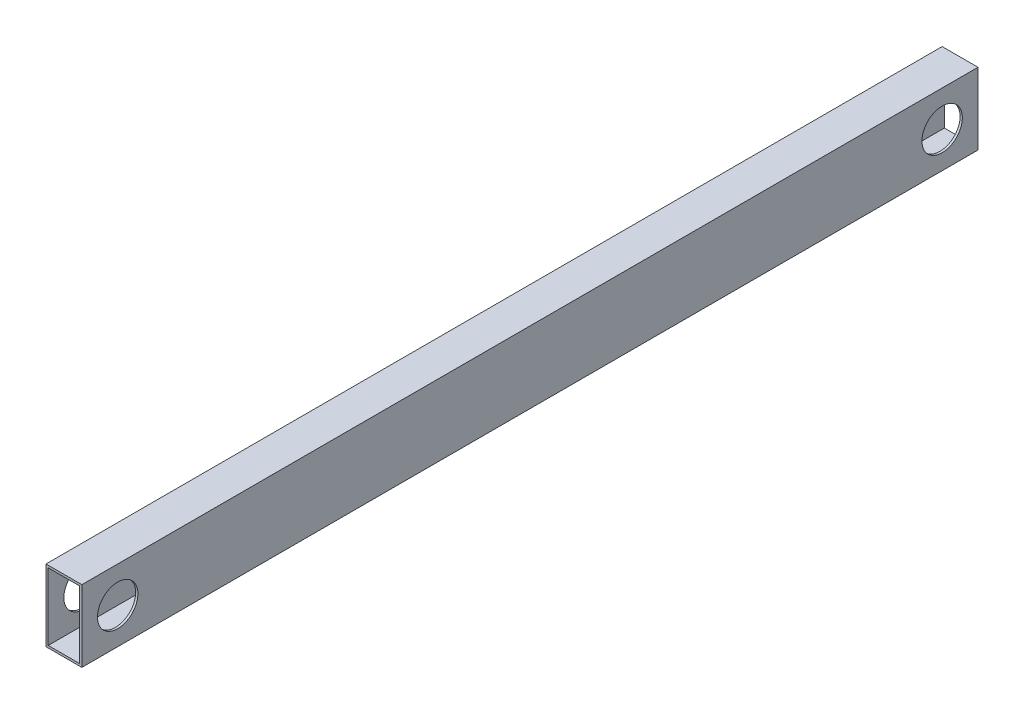
ISO-10303-21;
HEADER;
FILE_DESCRIPTION(('STEP AP214'),'2;1');
FILE_NAME('part.step','',(''),(''),'','','');
FILE_SCHEMA(('AUTOMOTIVE_DESIGN { 1 0 10303 214 1 1 1 1 }'));
ENDSEC;
DATA;
#1=APPLICATION_CONTEXT('core data for automotive mechanical design processes');
#2=APPLICATION_PROTOCOL_DEFINITION('international standard','automotive_design',2000,#1);
#3=PRODUCT_CONTEXT('',#1,'mechanical');
#4=PRODUCT('Part','Part','',(#3));
#5=PRODUCT_RELATED_PRODUCT_CATEGORY('part','',(#4));
#6=PRODUCT_DEFINITION_FORMATION('','',#4);
#7=PRODUCT_DEFINITION_CONTEXT('part definition',#1,'design');
#8=PRODUCT_DEFINITION('design','',#6,#7);
#9=PRODUCT_DEFINITION_SHAPE('','',#8);
#10=(LENGTH_UNIT() NAMED_UNIT(*) SI_UNIT(.MILLI.,.METRE.));
#11=(NAMED_UNIT(*) PLANE_ANGLE_UNIT() SI_UNIT($,.RADIAN.));
#12=(NAMED_UNIT(*) SI_UNIT($,.STERADIAN.) SOLID_ANGLE_UNIT());
#13=UNCERTAINTY_MEASURE_WITH_UNIT(LENGTH_MEASURE(1.E-05),#10,'distance_accuracy_value','');
#14=(GEOMETRIC_REPRESENTATION_CONTEXT(3) GLOBAL_UNCERTAINTY_ASSIGNED_CONTEXT((#13)) GLOBAL_UNIT_ASSIGNED_CONTEXT((#10,
#11,#12)) REPRESENTATION_CONTEXT('',''));
#15=CARTESIAN_POINT('',(0.,0.,0.));
#16=DIRECTION('',(0.,0.,1.));
#17=DIRECTION('',(1.,0.,0.));
#18=AXIS2_PLACEMENT_3D('',#15,#16,#17);
#19=CARTESIAN_POINT('',(0.,0.,635.));
#20=DIRECTION('',(0.,0.,-1.));
#21=DIRECTION('',(-1.,0.,0.));
#22=AXIS2_PLACEMENT_3D('',#19,#20,#21);
#23=PLANE('',#22);
#24=DIRECTION('',(0.,-1.,0.));
#25=VECTOR('',#24,1.);
#26=CARTESIAN_POINT('',(0.,0.,635.));
#27=LINE('',#26,#25);
#28=CARTESIAN_POINT('',(0.,50.8,635.));
#29=VERTEX_POINT('',#28);
#30=CARTESIAN_POINT('',(0.,0.,635.));
#31=VERTEX_POINT('',#30);
#32=EDGE_CURVE('E138',#29,#31,#27,.T.);
#33=ORIENTED_EDGE('',*,*,#32,.T.);
#34=DIRECTION('',(1.,0.,0.));
#35=VECTOR('',#34,1.);
#36=CARTESIAN_POINT('',(0.,0.,635.));
#37=LINE('',#36,#35);
#38=CARTESIAN_POINT('',(25.4,0.,635.));
#39=VERTEX_POINT('',#38);
#40=EDGE_CURVE('E141',#31,#39,#37,.T.);
#41=ORIENTED_EDGE('',*,*,#40,.T.);
#42=DIRECTION('',(0.,1.,0.));
#43=VECTOR('',#42,1.);
#44=CARTESIAN_POINT('',(25.4,0.,635.));
#45=LINE('',#44,#43);
#46=CARTESIAN_POINT('',(25.4,50.8,635.));
#47=VERTEX_POINT('',#46);
#48=EDGE_CURVE('E144',#39,#47,#45,.T.);
#49=ORIENTED_EDGE('',*,*,#48,.T.);
#50=DIRECTION('',(-1.,0.,0.));
#51=VECTOR('',#50,1.);
#52=CARTESIAN_POINT('',(0.,50.8,635.));
#53=LINE('',#52,#51);
#54=EDGE_CURVE('E146',#47,#29,#53,.T.);
#55=ORIENTED_EDGE('',*,*,#54,.T.);
#56=EDGE_LOOP('',(#33,#41,#49,#55));
#57=FACE_BOUND('',#56,.T.);
#58=DIRECTION('',(0.,1.,0.));
#59=VECTOR('',#58,1.);
#60=CARTESIAN_POINT('',(23.8125,49.2125,635.));
#61=LINE('',#60,#59);
#62=CARTESIAN_POINT('',(23.8125,1.58749999999999,635.));
#63=VERTEX_POINT('',#62);
#64=CARTESIAN_POINT('',(23.8125,49.2125,635.));
#65=VERTEX_POINT('',#64);
#66=EDGE_CURVE('E100',#63,#65,#61,.T.);
#67=ORIENTED_EDGE('',*,*,#66,.F.);
#68=DIRECTION('',(1.,0.,0.));
#69=VECTOR('',#68,1.);
#70=CARTESIAN_POINT('',(1.5875,1.58749999999999,635.));
#71=LINE('',#70,#69);
#72=CARTESIAN_POINT('',(1.5875,1.58749999999999,635.));
#73=VERTEX_POINT('',#72);
#74=EDGE_CURVE('E122',#73,#63,#71,.T.);
#75=ORIENTED_EDGE('',*,*,#74,.F.);
#76=DIRECTION('',(0.,-1.,0.));
#77=VECTOR('',#76,1.);
#78=CARTESIAN_POINT('',(1.5875,49.2125,635.));
#79=LINE('',#78,#77);
#80=CARTESIAN_POINT('',(1.5875,49.2125,635.));
#81=VERTEX_POINT('',#80);
#82=EDGE_CURVE('E120',#81,#73,#79,.T.);
#83=ORIENTED_EDGE('',*,*,#82,.F.);
#84=DIRECTION('',(-1.,0.,0.));
#85=VECTOR('',#84,1.);
#86=CARTESIAN_POINT('',(1.5875,49.2125,635.));
#87=LINE('',#86,#85);
#88=EDGE_CURVE('E108',#65,#81,#87,.T.);
#89=ORIENTED_EDGE('',*,*,#88,.F.);
#90=EDGE_LOOP('',(#67,#75,#83,#89));
#91=FACE_BOUND('',#90,.T.);
#92=ADVANCED_FACE('F33',(#57,#91),#23,.F.);
#93=CARTESIAN_POINT('',(0.,0.,0.));
#94=DIRECTION('',(0.,0.,-1.));
#95=DIRECTION('',(-1.,0.,0.));
#96=AXIS2_PLACEMENT_3D('',#93,#94,#95);
#97=PLANE('',#96);
#98=DIRECTION('',(0.,-1.,0.));
#99=VECTOR('',#98,1.);
#100=CARTESIAN_POINT('',(0.,0.,0.));
#101=LINE('',#100,#99);
#102=CARTESIAN_POINT('',(0.,50.8,0.));
#103=VERTEX_POINT('',#102);
#104=CARTESIAN_POINT('',(0.,0.,0.));
#105=VERTEX_POINT('',#104);
#106=EDGE_CURVE('E116',#103,#105,#101,.T.);
#107=ORIENTED_EDGE('',*,*,#106,.F.);
#108=DIRECTION('',(-1.,0.,0.));
#109=VECTOR('',#108,1.);
#110=CARTESIAN_POINT('',(0.,50.8,0.));
#111=LINE('',#110,#109);
#112=CARTESIAN_POINT('',(25.4,50.8,0.));
#113=VERTEX_POINT('',#112);
#114=EDGE_CURVE('E142',#113,#103,#111,.T.);
#115=ORIENTED_EDGE('',*,*,#114,.F.);
#116=DIRECTION('',(0.,1.,0.));
#117=VECTOR('',#116,1.);
#118=CARTESIAN_POINT('',(25.4,0.,0.));
#119=LINE('',#118,#117);
#120=CARTESIAN_POINT('',(25.4,0.,0.));
#121=VERTEX_POINT('',#120);
#122=EDGE_CURVE('E153',#121,#113,#119,.T.);
#123=ORIENTED_EDGE('',*,*,#122,.F.);
#124=DIRECTION('',(1.,0.,0.));
#125=VECTOR('',#124,1.);
#126=CARTESIAN_POINT('',(0.,0.,0.));
#127=LINE('',#126,#125);
#128=EDGE_CURVE('E151',#105,#121,#127,.T.);
#129=ORIENTED_EDGE('',*,*,#128,.F.);
#130=EDGE_LOOP('',(#107,#115,#123,#129));
#131=FACE_BOUND('',#130,.T.);
#132=DIRECTION('',(1.,0.,0.));
#133=VECTOR('',#132,1.);
#134=CARTESIAN_POINT('',(1.5875,1.58749999999999,0.));
#135=LINE('',#134,#133);
#136=CARTESIAN_POINT('',(1.5875,1.58749999999999,0.));
#137=VERTEX_POINT('',#136);
#138=CARTESIAN_POINT('',(23.8125,1.58749999999999,0.));
#139=VERTEX_POINT('',#138);
#140=EDGE_CURVE('E109',#137,#139,#135,.T.);
#141=ORIENTED_EDGE('',*,*,#140,.T.);
#142=DIRECTION('',(0.,1.,0.));
#143=VECTOR('',#142,1.);
#144=CARTESIAN_POINT('',(23.8125,49.2125,0.));
#145=LINE('',#144,#143);
#146=CARTESIAN_POINT('',(23.8125,49.2125,0.));
#147=VERTEX_POINT('',#146);
#148=EDGE_CURVE('E58',#139,#147,#145,.T.);
#149=ORIENTED_EDGE('',*,*,#148,.T.);
#150=DIRECTION('',(-1.,0.,0.));
#151=VECTOR('',#150,1.);
#152=CARTESIAN_POINT('',(1.5875,49.2125,0.));
#153=LINE('',#152,#151);
#154=CARTESIAN_POINT('',(1.5875,49.2125,0.));
#155=VERTEX_POINT('',#154);
#156=EDGE_CURVE('E115',#147,#155,#153,.T.);
#157=ORIENTED_EDGE('',*,*,#156,.T.);
#158=DIRECTION('',(0.,-1.,0.));
#159=VECTOR('',#158,1.);
#160=CARTESIAN_POINT('',(1.5875,49.2125,0.));
#161=LINE('',#160,#159);
#162=EDGE_CURVE('E130',#155,#137,#161,.T.);
#163=ORIENTED_EDGE('',*,*,#162,.T.);
#164=EDGE_LOOP('',(#141,#149,#157,#163));
#165=FACE_BOUND('',#164,.T.);
#166=ADVANCED_FACE('F204',(#131,#165),#97,.T.);
#167=CARTESIAN_POINT('',(0.,0.,635.));
#168=DIRECTION('',(1.,0.,0.));
#169=DIRECTION('',(0.,0.,-1.));
#170=AXIS2_PLACEMENT_3D('',#167,#168,#169);
#171=PLANE('',#170);
#172=CARTESIAN_POINT('',(0.,25.4,25.4));
#173=DIRECTION('',(1.,0.,0.));
#174=DIRECTION('',(0.,0.,-1.));
#175=AXIS2_PLACEMENT_3D('',#172,#173,#174);
#176=CIRCLE('',#175,14.3129);
#177=CARTESIAN_POINT('',(0.,25.4,11.0871));
#178=VERTEX_POINT('',#177);
#179=EDGE_CURVE('E165',#178,#178,#176,.T.);
#180=ORIENTED_EDGE('',*,*,#179,.T.);
#181=EDGE_LOOP('',(#180));
#182=FACE_BOUND('',#181,.T.);
#183=CARTESIAN_POINT('',(0.,25.4,609.6));
#184=DIRECTION('',(1.,0.,0.));
#185=DIRECTION('',(0.,0.,1.));
#186=AXIS2_PLACEMENT_3D('',#183,#184,#185);
#187=CIRCLE('',#186,14.3129);
#188=CARTESIAN_POINT('',(0.,25.4,623.9129));
#189=VERTEX_POINT('',#188);
#190=EDGE_CURVE('E172',#189,#189,#187,.T.);
#191=ORIENTED_EDGE('',*,*,#190,.T.);
#192=EDGE_LOOP('',(#191));
#193=FACE_BOUND('',#192,.T.);
#194=ORIENTED_EDGE('',*,*,#106,.T.);
#195=DIRECTION('',(0.,0.,-1.));
#196=VECTOR('',#195,1.);
#197=CARTESIAN_POINT('',(0.,0.,635.));
#198=LINE('',#197,#196);
#199=EDGE_CURVE('E11',#31,#105,#198,.T.);
#200=ORIENTED_EDGE('',*,*,#199,.F.);
#201=ORIENTED_EDGE('',*,*,#32,.F.);
#202=DIRECTION('',(0.,0.,-1.));
#203=VECTOR('',#202,1.);
#204=CARTESIAN_POINT('',(0.,50.8,635.));
#205=LINE('',#204,#203);
#206=EDGE_CURVE('E148',#29,#103,#205,.T.);
#207=ORIENTED_EDGE('',*,*,#206,.T.);
#208=EDGE_LOOP('',(#194,#200,#201,#207));
#209=FACE_BOUND('',#208,.T.);
#210=ADVANCED_FACE('F35',(#182,#193,#209),#171,.F.);
#211=CARTESIAN_POINT('',(0.,0.,635.));
#212=DIRECTION('',(0.,1.,0.));
#213=DIRECTION('',(0.,0.,1.));
#214=AXIS2_PLACEMENT_3D('',#211,#212,#213);
#215=PLANE('',#214);
#216=ORIENTED_EDGE('',*,*,#128,.T.);
#217=DIRECTION('',(0.,0.,-1.));
#218=VECTOR('',#217,1.);
#219=CARTESIAN_POINT('',(25.4,0.,635.));
#220=LINE('',#219,#218);
#221=EDGE_CURVE('E42',#39,#121,#220,.T.);
#222=ORIENTED_EDGE('',*,*,#221,.F.);
#223=ORIENTED_EDGE('',*,*,#40,.F.);
#224=ORIENTED_EDGE('',*,*,#199,.T.);
#225=EDGE_LOOP('',(#216,#222,#223,#224));
#226=FACE_BOUND('',#225,.T.);
#227=ADVANCED_FACE('F220',(#226),#215,.F.);
#228=CARTESIAN_POINT('',(25.4,0.,635.));
#229=DIRECTION('',(-1.,0.,0.));
#230=DIRECTION('',(0.,0.,1.));
#231=AXIS2_PLACEMENT_3D('',#228,#229,#230);
#232=PLANE('',#231);
#233=CARTESIAN_POINT('',(25.4,25.4,25.4));
#234=DIRECTION('',(-1.,0.,0.));
#235=DIRECTION('',(0.,0.,1.));
#236=AXIS2_PLACEMENT_3D('',#233,#234,#235);
#237=CIRCLE('',#236,14.3129);
#238=CARTESIAN_POINT('',(25.4,25.4,11.0871));
#239=VERTEX_POINT('',#238);
#240=EDGE_CURVE('E128',#239,#239,#237,.T.);
#241=ORIENTED_EDGE('',*,*,#240,.T.);
#242=EDGE_LOOP('',(#241));
#243=FACE_BOUND('',#242,.T.);
#244=CARTESIAN_POINT('',(25.4,25.4,609.6));
#245=DIRECTION('',(-1.,0.,0.));
#246=DIRECTION('',(0.,0.,1.));
#247=AXIS2_PLACEMENT_3D('',#244,#245,#246);
#248=CIRCLE('',#247,14.3129);
#249=CARTESIAN_POINT('',(25.4,25.4,595.2871));
#250=VERTEX_POINT('',#249);
#251=EDGE_CURVE('E169',#250,#250,#248,.T.);
#252=ORIENTED_EDGE('',*,*,#251,.T.);
#253=EDGE_LOOP('',(#252));
#254=FACE_BOUND('',#253,.T.);
#255=ORIENTED_EDGE('',*,*,#122,.T.);
#256=DIRECTION('',(0.,0.,-1.));
#257=VECTOR('',#256,1.);
#258=CARTESIAN_POINT('',(25.4,50.8,635.));
#259=LINE('',#258,#257);
#260=EDGE_CURVE('E158',#47,#113,#259,.T.);
#261=ORIENTED_EDGE('',*,*,#260,.F.);
#262=ORIENTED_EDGE('',*,*,#48,.F.);
#263=ORIENTED_EDGE('',*,*,#221,.T.);
#264=EDGE_LOOP('',(#255,#261,#262,#263));
#265=FACE_BOUND('',#264,.T.);
#266=ADVANCED_FACE('F186',(#243,#254,#265),#232,.F.);
#267=CARTESIAN_POINT('',(0.,50.8,635.));
#268=DIRECTION('',(0.,-1.,0.));
#269=DIRECTION('',(0.,0.,-1.));
#270=AXIS2_PLACEMENT_3D('',#267,#268,#269);
#271=PLANE('',#270);
#272=ORIENTED_EDGE('',*,*,#114,.T.);
#273=ORIENTED_EDGE('',*,*,#206,.F.);
#274=ORIENTED_EDGE('',*,*,#54,.F.);
#275=ORIENTED_EDGE('',*,*,#260,.T.);
#276=EDGE_LOOP('',(#272,#273,#274,#275));
#277=FACE_BOUND('',#276,.T.);
#278=ADVANCED_FACE('F215',(#277),#271,.F.);
#279=CARTESIAN_POINT('',(23.8125,49.2125,635.));
#280=DIRECTION('',(-1.,0.,0.));
#281=DIRECTION('',(0.,0.,1.));
#282=AXIS2_PLACEMENT_3D('',#279,#280,#281);
#283=PLANE('',#282);
#284=CARTESIAN_POINT('',(23.8125,25.4,25.4));
#285=DIRECTION('',(-1.,0.,0.));
#286=DIRECTION('',(0.,0.,1.));
#287=AXIS2_PLACEMENT_3D('',#284,#285,#286);
#288=CIRCLE('',#287,14.3129);
#289=CARTESIAN_POINT('',(23.8125,25.4,11.0871));
#290=VERTEX_POINT('',#289);
#291=EDGE_CURVE('E181',#290,#290,#288,.T.);
#292=ORIENTED_EDGE('',*,*,#291,.F.);
#293=EDGE_LOOP('',(#292));
#294=FACE_BOUND('',#293,.T.);
#295=CARTESIAN_POINT('',(23.8125,25.4,609.6));
#296=DIRECTION('',(-1.,0.,0.));
#297=DIRECTION('',(0.,0.,1.));
#298=AXIS2_PLACEMENT_3D('',#295,#296,#297);
#299=CIRCLE('',#298,14.3129);
#300=CARTESIAN_POINT('',(23.8125,25.4,595.2871));
#301=VERTEX_POINT('',#300);
#302=EDGE_CURVE('E164',#301,#301,#299,.T.);
#303=ORIENTED_EDGE('',*,*,#302,.F.);
#304=EDGE_LOOP('',(#303));
#305=FACE_BOUND('',#304,.T.);
#306=ORIENTED_EDGE('',*,*,#148,.F.);
#307=DIRECTION('',(0.,0.,-1.));
#308=VECTOR('',#307,1.);
#309=CARTESIAN_POINT('',(23.8125,1.58749999999999,635.));
#310=LINE('',#309,#308);
#311=EDGE_CURVE('E104',#63,#139,#310,.T.);
#312=ORIENTED_EDGE('',*,*,#311,.F.);
#313=ORIENTED_EDGE('',*,*,#66,.T.);
#314=DIRECTION('',(0.,0.,-1.));
#315=VECTOR('',#314,1.);
#316=CARTESIAN_POINT('',(23.8125,49.2125,635.));
#317=LINE('',#316,#315);
#318=EDGE_CURVE('E103',#65,#147,#317,.T.);
#319=ORIENTED_EDGE('',*,*,#318,.T.);
#320=EDGE_LOOP('',(#306,#312,#313,#319));
#321=FACE_BOUND('',#320,.T.);
#322=ADVANCED_FACE('F102',(#294,#305,#321),#283,.T.);
#323=CARTESIAN_POINT('',(1.5875,49.2125,635.));
#324=DIRECTION('',(0.,-1.,0.));
#325=DIRECTION('',(0.,0.,-1.));
#326=AXIS2_PLACEMENT_3D('',#323,#324,#325);
#327=PLANE('',#326);
#328=ORIENTED_EDGE('',*,*,#156,.F.);
#329=ORIENTED_EDGE('',*,*,#318,.F.);
#330=ORIENTED_EDGE('',*,*,#88,.T.);
#331=DIRECTION('',(0.,0.,-1.));
#332=VECTOR('',#331,1.);
#333=CARTESIAN_POINT('',(1.5875,49.2125,635.));
#334=LINE('',#333,#332);
#335=EDGE_CURVE('E117',#81,#155,#334,.T.);
#336=ORIENTED_EDGE('',*,*,#335,.T.);
#337=EDGE_LOOP('',(#328,#329,#330,#336));
#338=FACE_BOUND('',#337,.T.);
#339=ADVANCED_FACE('F112',(#338),#327,.T.);
#340=CARTESIAN_POINT('',(1.5875,49.2125,635.));
#341=DIRECTION('',(1.,0.,0.));
#342=DIRECTION('',(0.,0.,-1.));
#343=AXIS2_PLACEMENT_3D('',#340,#341,#342);
#344=PLANE('',#343);
#345=CARTESIAN_POINT('',(1.5875,25.4,25.4));
#346=DIRECTION('',(1.,0.,0.));
#347=DIRECTION('',(0.,0.,-1.));
#348=AXIS2_PLACEMENT_3D('',#345,#346,#347);
#349=CIRCLE('',#348,14.3129);
#350=CARTESIAN_POINT('',(1.5875,25.4,11.0871));
#351=VERTEX_POINT('',#350);
#352=EDGE_CURVE('E37',#351,#351,#349,.T.);
#353=ORIENTED_EDGE('',*,*,#352,.F.);
#354=EDGE_LOOP('',(#353));
#355=FACE_BOUND('',#354,.T.);
#356=CARTESIAN_POINT('',(1.5875,25.4,609.6));
#357=DIRECTION('',(1.,0.,0.));
#358=DIRECTION('',(0.,0.,-1.));
#359=AXIS2_PLACEMENT_3D('',#356,#357,#358);
#360=CIRCLE('',#359,14.3129);
#361=CARTESIAN_POINT('',(1.5875,25.4,595.2871));
#362=VERTEX_POINT('',#361);
#363=EDGE_CURVE('E162',#362,#362,#360,.T.);
#364=ORIENTED_EDGE('',*,*,#363,.F.);
#365=EDGE_LOOP('',(#364));
#366=FACE_BOUND('',#365,.T.);
#367=ORIENTED_EDGE('',*,*,#162,.F.);
#368=ORIENTED_EDGE('',*,*,#335,.F.);
#369=ORIENTED_EDGE('',*,*,#82,.T.);
#370=DIRECTION('',(0.,0.,-1.));
#371=VECTOR('',#370,1.);
#372=CARTESIAN_POINT('',(1.5875,1.58749999999999,635.));
#373=LINE('',#372,#371);
#374=EDGE_CURVE('E50',#73,#137,#373,.T.);
#375=ORIENTED_EDGE('',*,*,#374,.T.);
#376=EDGE_LOOP('',(#367,#368,#369,#375));
#377=FACE_BOUND('',#376,.T.);
#378=ADVANCED_FACE('F242',(#355,#366,#377),#344,.T.);
#379=CARTESIAN_POINT('',(1.5875,1.58749999999999,635.));
#380=DIRECTION('',(0.,1.,0.));
#381=DIRECTION('',(0.,0.,1.));
#382=AXIS2_PLACEMENT_3D('',#379,#380,#381);
#383=PLANE('',#382);
#384=ORIENTED_EDGE('',*,*,#140,.F.);
#385=ORIENTED_EDGE('',*,*,#374,.F.);
#386=ORIENTED_EDGE('',*,*,#74,.T.);
#387=ORIENTED_EDGE('',*,*,#311,.T.);
#388=EDGE_LOOP('',(#384,#385,#386,#387));
#389=FACE_BOUND('',#388,.T.);
#390=ADVANCED_FACE('F240',(#389),#383,.T.);
#391=CARTESIAN_POINT('',(0.,25.4,609.6));
#392=DIRECTION('',(1.,0.,0.));
#393=DIRECTION('',(0.,0.,-1.));
#394=AXIS2_PLACEMENT_3D('',#391,#392,#393);
#395=CYLINDRICAL_SURFACE('',#394,14.3129);
#396=ORIENTED_EDGE('',*,*,#363,.T.);
#397=EDGE_LOOP('',(#396));
#398=FACE_BOUND('',#397,.T.);
#399=ORIENTED_EDGE('',*,*,#190,.F.);
#400=EDGE_LOOP('',(#399));
#401=FACE_BOUND('',#400,.T.);
#402=ADVANCED_FACE('F200',(#398,#401),#395,.F.);
#403=CARTESIAN_POINT('',(0.,25.4,25.4));
#404=DIRECTION('',(1.,0.,0.));
#405=DIRECTION('',(0.,0.,-1.));
#406=AXIS2_PLACEMENT_3D('',#403,#404,#405);
#407=CYLINDRICAL_SURFACE('',#406,14.3129);
#408=ORIENTED_EDGE('',*,*,#352,.T.);
#409=EDGE_LOOP('',(#408));
#410=FACE_BOUND('',#409,.T.);
#411=ORIENTED_EDGE('',*,*,#179,.F.);
#412=EDGE_LOOP('',(#411));
#413=FACE_BOUND('',#412,.T.);
#414=ADVANCED_FACE('F194',(#410,#413),#407,.F.);
#415=CARTESIAN_POINT('',(23.8125,25.4,595.2871));
#416=CARTESIAN_POINT('',(23.8290364583333,25.4,595.2871));
#417=CARTESIAN_POINT('',(23.8455729166667,25.4,595.2871));
#418=CARTESIAN_POINT('',(23.8786458333333,25.4,595.2871));
#419=CARTESIAN_POINT('',(23.8951822916667,25.4,595.2871));
#420=CARTESIAN_POINT('',(23.9282552083333,25.4,595.2871));
#421=CARTESIAN_POINT('',(23.9447916666667,25.4,595.2871));
#422=CARTESIAN_POINT('',(23.9778645833333,25.4,595.2871));
#423=CARTESIAN_POINT('',(23.9944010416667,25.4,595.2871));
#424=CARTESIAN_POINT('',(24.0274739583333,25.4,595.2871));
#425=CARTESIAN_POINT('',(24.0440104166667,25.4,595.2871));
#426=CARTESIAN_POINT('',(24.0770833333333,25.4,595.2871));
#427=CARTESIAN_POINT('',(24.0936197916667,25.4,595.2871));
#428=CARTESIAN_POINT('',(24.1266927083333,25.4,595.2871));
#429=CARTESIAN_POINT('',(24.1432291666667,25.4,595.2871));
#430=CARTESIAN_POINT('',(24.1763020833333,25.4,595.2871));
#431=CARTESIAN_POINT('',(24.1928385416667,25.4,595.2871));
#432=CARTESIAN_POINT('',(24.2259114583333,25.4,595.2871));
#433=CARTESIAN_POINT('',(24.2424479166667,25.4,595.2871));
#434=CARTESIAN_POINT('',(24.2755208333333,25.4,595.2871));
#435=CARTESIAN_POINT('',(24.2920572916667,25.4,595.2871));
#436=CARTESIAN_POINT('',(24.3251302083333,25.4,595.2871));
#437=CARTESIAN_POINT('',(24.3416666666667,25.4,595.2871));
#438=CARTESIAN_POINT('',(24.3747395833333,25.4,595.2871));
#439=CARTESIAN_POINT('',(24.3912760416667,25.4,595.2871));
#440=CARTESIAN_POINT('',(24.4243489583333,25.4,595.2871));
#441=CARTESIAN_POINT('',(24.4408854166667,25.4,595.2871));
#442=CARTESIAN_POINT('',(24.4739583333333,25.4,595.2871));
#443=CARTESIAN_POINT('',(24.4904947916667,25.4,595.2871));
#444=CARTESIAN_POINT('',(24.5235677083333,25.4,595.2871));
#445=CARTESIAN_POINT('',(24.5401041666667,25.4,595.2871));
#446=CARTESIAN_POINT('',(24.5731770833333,25.4,595.2871));
#447=CARTESIAN_POINT('',(24.5897135416667,25.4,595.2871));
#448=CARTESIAN_POINT('',(24.6227864583333,25.4,595.2871));
#449=CARTESIAN_POINT('',(24.6393229166667,25.4,595.2871));
#450=CARTESIAN_POINT('',(24.6723958333333,25.4,595.2871));
#451=CARTESIAN_POINT('',(24.6889322916667,25.4,595.2871));
#452=CARTESIAN_POINT('',(24.7220052083333,25.4,595.2871));
#453=CARTESIAN_POINT('',(24.7385416666667,25.4,595.2871));
#454=CARTESIAN_POINT('',(24.7716145833333,25.4,595.2871));
#455=CARTESIAN_POINT('',(24.7881510416667,25.4,595.2871));
#456=CARTESIAN_POINT('',(24.8212239583333,25.4,595.2871));
#457=CARTESIAN_POINT('',(24.8377604166667,25.4,595.2871));
#458=CARTESIAN_POINT('',(24.8708333333333,25.4,595.2871));
#459=CARTESIAN_POINT('',(24.8873697916667,25.4,595.2871));
#460=CARTESIAN_POINT('',(24.9204427083333,25.4,595.2871));
#461=CARTESIAN_POINT('',(24.9369791666667,25.4,595.2871));
#462=CARTESIAN_POINT('',(24.9700520833333,25.4,595.2871));
#463=CARTESIAN_POINT('',(24.9865885416667,25.4,595.2871));
#464=CARTESIAN_POINT('',(25.0196614583333,25.4,595.2871));
#465=CARTESIAN_POINT('',(25.0361979166667,25.4,595.2871));
#466=CARTESIAN_POINT('',(25.0692708333333,25.4,595.2871));
#467=CARTESIAN_POINT('',(25.0858072916667,25.4,595.2871));
#468=CARTESIAN_POINT('',(25.1188802083333,25.4,595.2871));
#469=CARTESIAN_POINT('',(25.1354166666667,25.4,595.2871));
#470=CARTESIAN_POINT('',(25.1684895833333,25.4,595.2871));
#471=CARTESIAN_POINT('',(25.1850260416667,25.4,595.2871));
#472=CARTESIAN_POINT('',(25.2180989583333,25.4,595.2871));
#473=CARTESIAN_POINT('',(25.2346354166667,25.4,595.2871));
#474=CARTESIAN_POINT('',(25.2677083333333,25.4,595.2871));
#475=CARTESIAN_POINT('',(25.2842447916667,25.4,595.2871));
#476=CARTESIAN_POINT('',(25.3173177083333,25.4,595.2871));
#477=CARTESIAN_POINT('',(25.3338541666667,25.4,595.2871));
#478=CARTESIAN_POINT('',(25.3669270833333,25.4,595.2871));
#479=CARTESIAN_POINT('',(25.3834635416667,25.4,595.2871));
#480=CARTESIAN_POINT('',(25.4,25.4,595.2871));
#481=B_SPLINE_CURVE_WITH_KNOTS('',3,(#415,#416,#417,#418,#419,#420,#421,#422,#423,#424,#425,
#426,#427,#428,#429,#430,#431,#432,#433,#434,#435,#436,#437,#438,#439,#440,#441,#442,#443,#444,
#445,#446,#447,#448,#449,#450,#451,#452,#453,#454,#455,#456,#457,#458,#459,#460,#461,#462,#463,
#464,#465,#466,#467,#468,#469,#470,#471,#472,#473,#474,#475,#476,#477,#478,#479,#480),
.UNSPECIFIED.,.F.,.F.,(4,2,2,2,2,2,2,2,2,2,2,2,2,2,2,2,2,2,2,2,2,2,2,2,2,2,2,2,2,2,2,2,4),(0.,
0.0496093749999989,0.0992187500000012,0.148828125,0.198437500000002,0.248046875000001,
0.29765625,0.347265625000003,0.396875000000001,0.446484375,0.496093750000003,0.545703125000002,
0.5953125,0.644921875000003,0.694531250000002,0.744140625000004,0.793750000000003,
0.843359375000002,0.892968750000004,0.942578125000003,0.992187500000005,1.041796875,1.09140625,
1.14101562500001,1.190625,1.240234375,1.28984375000001,1.339453125,1.3890625,1.43867187500001,
1.48828125,1.53789062500001,1.58750000000001),.UNSPECIFIED.);
#482=EDGE_CURVE('BSEAM191',#301,#250,#481,.T.);
#483=ORIENTED_EDGE('',*,*,#302,.T.);
#484=ORIENTED_EDGE('',*,*,#251,.F.);
#485=ORIENTED_EDGE('',*,*,#482,.T.);
#486=ORIENTED_EDGE('',*,*,#482,.F.);
#487=EDGE_LOOP('',(#483,#485,#484,#486));
#488=FACE_BOUND('',#487,.T.);
#489=ADVANCED_FACE('F191',(#488),#395,.F.);
#490=CARTESIAN_POINT('',(23.8125,25.4,11.0871));
#491=CARTESIAN_POINT('',(23.8290364583333,25.4,11.0871));
#492=CARTESIAN_POINT('',(23.8455729166667,25.4,11.0871));
#493=CARTESIAN_POINT('',(23.8786458333333,25.4,11.0871));
#494=CARTESIAN_POINT('',(23.8951822916667,25.4,11.0871));
#495=CARTESIAN_POINT('',(23.9282552083333,25.4,11.0871));
#496=CARTESIAN_POINT('',(23.9447916666667,25.4,11.0871));
#497=CARTESIAN_POINT('',(23.9778645833333,25.4,11.0871));
#498=CARTESIAN_POINT('',(23.9944010416667,25.4,11.0871));
#499=CARTESIAN_POINT('',(24.0274739583333,25.4,11.0871));
#500=CARTESIAN_POINT('',(24.0440104166667,25.4,11.0871));
#501=CARTESIAN_POINT('',(24.0770833333333,25.4,11.0871));
#502=CARTESIAN_POINT('',(24.0936197916667,25.4,11.0871));
#503=CARTESIAN_POINT('',(24.1266927083333,25.4,11.0871));
#504=CARTESIAN_POINT('',(24.1432291666667,25.4,11.0871));
#505=CARTESIAN_POINT('',(24.1763020833333,25.4,11.0871));
#506=CARTESIAN_POINT('',(24.1928385416667,25.4,11.0871));
#507=CARTESIAN_POINT('',(24.2259114583333,25.4,11.0871));
#508=CARTESIAN_POINT('',(24.2424479166667,25.4,11.0871));
#509=CARTESIAN_POINT('',(24.2755208333333,25.4,11.0871));
#510=CARTESIAN_POINT('',(24.2920572916667,25.4,11.0871));
#511=CARTESIAN_POINT('',(24.3251302083333,25.4,11.0871));
#512=CARTESIAN_POINT('',(24.3416666666667,25.4,11.0871));
#513=CARTESIAN_POINT('',(24.3747395833333,25.4,11.0871));
#514=CARTESIAN_POINT('',(24.3912760416667,25.4,11.0871));
#515=CARTESIAN_POINT('',(24.4243489583333,25.4,11.0871));
#516=CARTESIAN_POINT('',(24.4408854166667,25.4,11.0871));
#517=CARTESIAN_POINT('',(24.4739583333333,25.4,11.0871));
#518=CARTESIAN_POINT('',(24.4904947916667,25.4,11.0871));
#519=CARTESIAN_POINT('',(24.5235677083333,25.4,11.0871));
#520=CARTESIAN_POINT('',(24.5401041666667,25.4,11.0871));
#521=CARTESIAN_POINT('',(24.5731770833333,25.4,11.0871));
#522=CARTESIAN_POINT('',(24.5897135416667,25.4,11.0871));
#523=CARTESIAN_POINT('',(24.6227864583333,25.4,11.0871));
#524=CARTESIAN_POINT('',(24.6393229166667,25.4,11.0871));
#525=CARTESIAN_POINT('',(24.6723958333333,25.4,11.0871));
#526=CARTESIAN_POINT('',(24.6889322916667,25.4,11.0871));
#527=CARTESIAN_POINT('',(24.7220052083333,25.4,11.0871));
#528=CARTESIAN_POINT('',(24.7385416666667,25.4,11.0871));
#529=CARTESIAN_POINT('',(24.7716145833333,25.4,11.0871));
#530=CARTESIAN_POINT('',(24.7881510416667,25.4,11.0871));
#531=CARTESIAN_POINT('',(24.8212239583333,25.4,11.0871));
#532=CARTESIAN_POINT('',(24.8377604166667,25.4,11.0871));
#533=CARTESIAN_POINT('',(24.8708333333333,25.4,11.0871));
#534=CARTESIAN_POINT('',(24.8873697916667,25.4,11.0871));
#535=CARTESIAN_POINT('',(24.9204427083333,25.4,11.0871));
#536=CARTESIAN_POINT('',(24.9369791666667,25.4,11.0871));
#537=CARTESIAN_POINT('',(24.9700520833333,25.4,11.0871));
#538=CARTESIAN_POINT('',(24.9865885416667,25.4,11.0871));
#539=CARTESIAN_POINT('',(25.0196614583333,25.4,11.0871));
#540=CARTESIAN_POINT('',(25.0361979166667,25.4,11.0871));
#541=CARTESIAN_POINT('',(25.0692708333333,25.4,11.0871));
#542=CARTESIAN_POINT('',(25.0858072916667,25.4,11.0871));
#543=CARTESIAN_POINT('',(25.1188802083333,25.4,11.0871));
#544=CARTESIAN_POINT('',(25.1354166666667,25.4,11.0871));
#545=CARTESIAN_POINT('',(25.1684895833333,25.4,11.0871));
#546=CARTESIAN_POINT('',(25.1850260416667,25.4,11.0871));
#547=CARTESIAN_POINT('',(25.2180989583333,25.4,11.0871));
#548=CARTESIAN_POINT('',(25.2346354166667,25.4,11.0871));
#549=CARTESIAN_POINT('',(25.2677083333333,25.4,11.0871));
#550=CARTESIAN_POINT('',(25.2842447916667,25.4,11.0871));
#551=CARTESIAN_POINT('',(25.3173177083333,25.4,11.0871));
#552=CARTESIAN_POINT('',(25.3338541666667,25.4,11.0871));
#553=CARTESIAN_POINT('',(25.3669270833333,25.4,11.0871));
#554=CARTESIAN_POINT('',(25.3834635416667,25.4,11.0871));
#555=CARTESIAN_POINT('',(25.4,25.4,11.0871));
#556=B_SPLINE_CURVE_WITH_KNOTS('',3,(#490,#491,#492,#493,#494,#495,#496,#497,#498,#499,#500,
#501,#502,#503,#504,#505,#506,#507,#508,#509,#510,#511,#512,#513,#514,#515,#516,#517,#518,#519,
#520,#521,#522,#523,#524,#525,#526,#527,#528,#529,#530,#531,#532,#533,#534,#535,#536,#537,#538,
#539,#540,#541,#542,#543,#544,#545,#546,#547,#548,#549,#550,#551,#552,#553,#554,#555),
.UNSPECIFIED.,.F.,.F.,(4,2,2,2,2,2,2,2,2,2,2,2,2,2,2,2,2,2,2,2,2,2,2,2,2,2,2,2,2,2,2,2,4),(0.,
0.0496093749999989,0.0992187500000012,0.148828125,0.198437500000002,0.248046875000001,
0.29765625,0.347265625000003,0.396875000000001,0.446484375,0.496093750000003,0.545703125000002,
0.5953125,0.644921875000003,0.694531250000002,0.744140625000004,0.793750000000003,
0.843359375000002,0.892968750000004,0.942578125000003,0.992187500000005,1.041796875,1.09140625,
1.14101562500001,1.190625,1.240234375,1.28984375000001,1.339453125,1.3890625,1.43867187500001,
1.48828125,1.53789062500001,1.58750000000001),.UNSPECIFIED.);
#557=EDGE_CURVE('BSEAM189',#290,#239,#556,.T.);
#558=ORIENTED_EDGE('',*,*,#291,.T.);
#559=ORIENTED_EDGE('',*,*,#240,.F.);
#560=ORIENTED_EDGE('',*,*,#557,.T.);
#561=ORIENTED_EDGE('',*,*,#557,.F.);
#562=EDGE_LOOP('',(#558,#560,#559,#561));
#563=FACE_BOUND('',#562,.T.);
#564=ADVANCED_FACE('F189',(#563),#407,.F.);
#565=CLOSED_SHELL('',(#92,#166,#210,#227,#266,#278,#322,#339,#378,#390,#402,#414,#489,#564));
#566=MANIFOLD_SOLID_BREP('B2',#565);
#567=ADVANCED_BREP_SHAPE_REPRESENTATION('',(#18,#566),#14);
#568=SHAPE_DEFINITION_REPRESENTATION(#9,#567);
ENDSEC;
END-ISO-10303-21;
